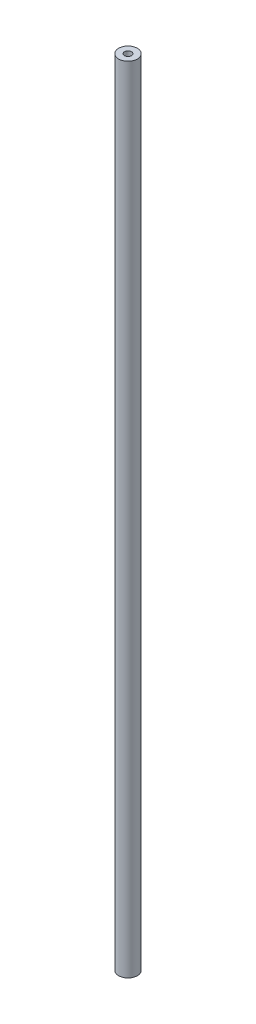
ISO-10303-21;
HEADER;
FILE_DESCRIPTION(('STEP AP214'),'2;1');
FILE_NAME('part.step','',(''),(''),'','','');
FILE_SCHEMA(('AUTOMOTIVE_DESIGN { 1 0 10303 214 1 1 1 1 }'));
ENDSEC;
DATA;
#1=APPLICATION_CONTEXT('core data for automotive mechanical design processes');
#2=APPLICATION_PROTOCOL_DEFINITION('international standard','automotive_design',2000,#1);
#3=PRODUCT_CONTEXT('',#1,'mechanical');
#4=PRODUCT('Part','Part','',(#3));
#5=PRODUCT_RELATED_PRODUCT_CATEGORY('part','',(#4));
#6=PRODUCT_DEFINITION_FORMATION('','',#4);
#7=PRODUCT_DEFINITION_CONTEXT('part definition',#1,'design');
#8=PRODUCT_DEFINITION('design','',#6,#7);
#9=PRODUCT_DEFINITION_SHAPE('','',#8);
#10=(LENGTH_UNIT() NAMED_UNIT(*) SI_UNIT(.MILLI.,.METRE.));
#11=(NAMED_UNIT(*) PLANE_ANGLE_UNIT() SI_UNIT($,.RADIAN.));
#12=(NAMED_UNIT(*) SI_UNIT($,.STERADIAN.) SOLID_ANGLE_UNIT());
#13=UNCERTAINTY_MEASURE_WITH_UNIT(LENGTH_MEASURE(1.E-05),#10,'distance_accuracy_value','');
#14=(GEOMETRIC_REPRESENTATION_CONTEXT(3) GLOBAL_UNCERTAINTY_ASSIGNED_CONTEXT((#13)) GLOBAL_UNIT_ASSIGNED_CONTEXT((#10,
#11,#12)) REPRESENTATION_CONTEXT('',''));
#15=CARTESIAN_POINT('',(0.,0.,0.));
#16=DIRECTION('',(0.,0.,1.));
#17=DIRECTION('',(1.,0.,0.));
#18=AXIS2_PLACEMENT_3D('',#15,#16,#17);
#19=CARTESIAN_POINT('',(-1.93206998513588,170.,-1.41071776692461));
#20=DIRECTION('',(0.,1.,0.));
#21=DIRECTION('',(0.,0.,1.));
#22=AXIS2_PLACEMENT_3D('',#19,#20,#21);
#23=PLANE('',#22);
#24=CARTESIAN_POINT('',(-1.93206998513588,170.,-1.41071776692461));
#25=DIRECTION('',(0.,1.,0.));
#26=DIRECTION('',(0.,0.,1.));
#27=AXIS2_PLACEMENT_3D('',#24,#25,#26);
#28=CIRCLE('',#27,2.);
#29=CARTESIAN_POINT('',(-1.93206998513588,170.,0.589282233075388));
#30=VERTEX_POINT('',#29);
#31=EDGE_CURVE('E10',#30,#30,#28,.T.);
#32=ORIENTED_EDGE('',*,*,#31,.T.);
#33=EDGE_LOOP('',(#32));
#34=FACE_BOUND('',#33,.T.);
#35=CARTESIAN_POINT('',(-1.93206998513588,170.,-1.41071776692461));
#36=DIRECTION('',(0.,1.,0.));
#37=DIRECTION('',(0.,0.,1.));
#38=AXIS2_PLACEMENT_3D('',#35,#36,#37);
#39=CIRCLE('',#38,0.75);
#40=CARTESIAN_POINT('',(-1.93206998513588,170.,-0.660717766924612));
#41=VERTEX_POINT('',#40);
#42=EDGE_CURVE('E42',#41,#41,#39,.T.);
#43=ORIENTED_EDGE('',*,*,#42,.F.);
#44=EDGE_LOOP('',(#43));
#45=FACE_BOUND('',#44,.T.);
#46=ADVANCED_FACE('F31',(#34,#45),#23,.T.);
#47=CARTESIAN_POINT('',(-1.93206998513588,0.,-1.41071776692461));
#48=DIRECTION('',(0.,1.,0.));
#49=DIRECTION('',(0.,0.,1.));
#50=AXIS2_PLACEMENT_3D('',#47,#48,#49);
#51=PLANE('',#50);
#52=CARTESIAN_POINT('',(-1.93206998513588,0.,-1.41071776692461));
#53=DIRECTION('',(0.,1.,0.));
#54=DIRECTION('',(0.,0.,1.));
#55=AXIS2_PLACEMENT_3D('',#52,#53,#54);
#56=CIRCLE('',#55,2.);
#57=CARTESIAN_POINT('',(-1.93206998513588,0.,0.589282233075388));
#58=VERTEX_POINT('',#57);
#59=EDGE_CURVE('E35',#58,#58,#56,.T.);
#60=ORIENTED_EDGE('',*,*,#59,.F.);
#61=EDGE_LOOP('',(#60));
#62=FACE_BOUND('',#61,.T.);
#63=CARTESIAN_POINT('',(-1.93206998513588,0.,-1.41071776692461));
#64=DIRECTION('',(0.,1.,0.));
#65=DIRECTION('',(0.,0.,1.));
#66=AXIS2_PLACEMENT_3D('',#63,#64,#65);
#67=CIRCLE('',#66,0.75);
#68=CARTESIAN_POINT('',(-1.93206998513588,0.,-0.660717766924612));
#69=VERTEX_POINT('',#68);
#70=EDGE_CURVE('E44',#69,#69,#67,.T.);
#71=ORIENTED_EDGE('',*,*,#70,.T.);
#72=EDGE_LOOP('',(#71));
#73=FACE_BOUND('',#72,.T.);
#74=ADVANCED_FACE('F54',(#62,#73),#51,.F.);
#75=CARTESIAN_POINT('',(-1.93206998513588,170.,-1.41071776692461));
#76=DIRECTION('',(0.,-1.,0.));
#77=DIRECTION('',(0.,0.,-1.));
#78=AXIS2_PLACEMENT_3D('',#75,#76,#77);
#79=CYLINDRICAL_SURFACE('',#78,2.);
#80=ORIENTED_EDGE('',*,*,#31,.F.);
#81=EDGE_LOOP('',(#80));
#82=FACE_BOUND('',#81,.T.);
#83=ORIENTED_EDGE('',*,*,#59,.T.);
#84=EDGE_LOOP('',(#83));
#85=FACE_BOUND('',#84,.T.);
#86=ADVANCED_FACE('F33',(#82,#85),#79,.T.);
#87=CARTESIAN_POINT('',(-1.93206998513588,170.,-1.41071776692461));
#88=DIRECTION('',(0.,-1.,0.));
#89=DIRECTION('',(0.,0.,-1.));
#90=AXIS2_PLACEMENT_3D('',#87,#88,#89);
#91=CYLINDRICAL_SURFACE('',#90,0.75);
#92=ORIENTED_EDGE('',*,*,#42,.T.);
#93=EDGE_LOOP('',(#92));
#94=FACE_BOUND('',#93,.T.);
#95=ORIENTED_EDGE('',*,*,#70,.F.);
#96=EDGE_LOOP('',(#95));
#97=FACE_BOUND('',#96,.T.);
#98=ADVANCED_FACE('F50',(#94,#97),#91,.F.);
#99=CLOSED_SHELL('',(#46,#74,#86,#98));
#100=MANIFOLD_SOLID_BREP('B2',#99);
#101=ADVANCED_BREP_SHAPE_REPRESENTATION('',(#18,#100),#14);
#102=SHAPE_DEFINITION_REPRESENTATION(#9,#101);
ENDSEC;
END-ISO-10303-21;
